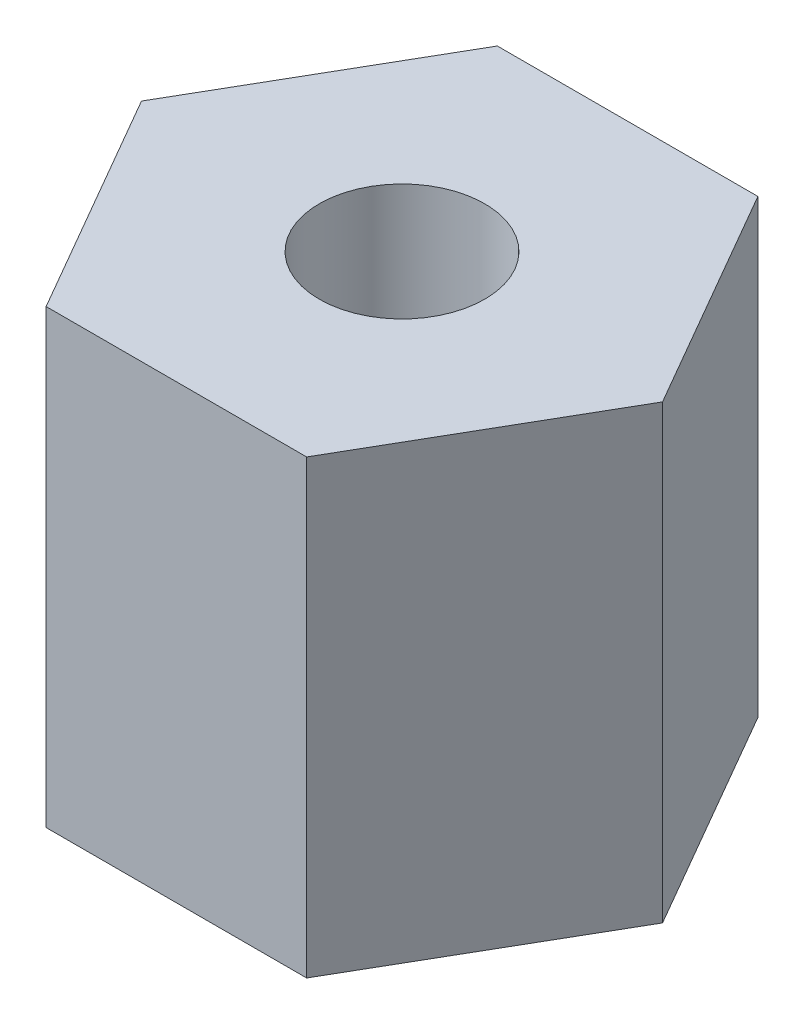
ISO-10303-21;
HEADER;
FILE_DESCRIPTION(('STEP AP214'),'2;1');
FILE_NAME('part.step','',(''),(''),'','','');
FILE_SCHEMA(('AUTOMOTIVE_DESIGN { 1 0 10303 214 1 1 1 1 }'));
ENDSEC;
DATA;
#1=APPLICATION_CONTEXT('core data for automotive mechanical design processes');
#2=APPLICATION_PROTOCOL_DEFINITION('international standard','automotive_design',2000,#1);
#3=PRODUCT_CONTEXT('',#1,'mechanical');
#4=PRODUCT('Part','Part','',(#3));
#5=PRODUCT_RELATED_PRODUCT_CATEGORY('part','',(#4));
#6=PRODUCT_DEFINITION_FORMATION('','',#4);
#7=PRODUCT_DEFINITION_CONTEXT('part definition',#1,'design');
#8=PRODUCT_DEFINITION('design','',#6,#7);
#9=PRODUCT_DEFINITION_SHAPE('','',#8);
#10=(LENGTH_UNIT() NAMED_UNIT(*) SI_UNIT(.MILLI.,.METRE.));
#11=(NAMED_UNIT(*) PLANE_ANGLE_UNIT() SI_UNIT($,.RADIAN.));
#12=(NAMED_UNIT(*) SI_UNIT($,.STERADIAN.) SOLID_ANGLE_UNIT());
#13=UNCERTAINTY_MEASURE_WITH_UNIT(LENGTH_MEASURE(1.E-05),#10,'distance_accuracy_value','');
#14=(GEOMETRIC_REPRESENTATION_CONTEXT(3) GLOBAL_UNCERTAINTY_ASSIGNED_CONTEXT((#13)) GLOBAL_UNIT_ASSIGNED_CONTEXT((#10,
#11,#12)) REPRESENTATION_CONTEXT('',''));
#15=CARTESIAN_POINT('',(0.,0.,0.));
#16=DIRECTION('',(0.,0.,1.));
#17=DIRECTION('',(1.,0.,0.));
#18=AXIS2_PLACEMENT_3D('',#15,#16,#17);
#19=CARTESIAN_POINT('',(0.,6.,0.));
#20=DIRECTION('',(0.,1.,0.));
#21=DIRECTION('',(0.,0.,1.));
#22=AXIS2_PLACEMENT_3D('',#19,#20,#21);
#23=PLANE('',#22);
#24=DIRECTION('',(0.5,0.,-0.866025403784439));
#25=VECTOR('',#24,1.);
#26=CARTESIAN_POINT('',(1.73205080756888,6.,3.));
#27=LINE('',#26,#25);
#28=CARTESIAN_POINT('',(1.73205080756888,6.,3.));
#29=VERTEX_POINT('',#28);
#30=CARTESIAN_POINT('',(3.46410161513775,6.,0.));
#31=VERTEX_POINT('',#30);
#32=EDGE_CURVE('E146',#29,#31,#27,.T.);
#33=ORIENTED_EDGE('',*,*,#32,.T.);
#34=DIRECTION('',(-0.5,0.,-0.866025403784438));
#35=VECTOR('',#34,1.);
#36=CARTESIAN_POINT('',(3.46410161513775,6.,0.));
#37=LINE('',#36,#35);
#38=CARTESIAN_POINT('',(1.73205080756888,6.,-3.));
#39=VERTEX_POINT('',#38);
#40=EDGE_CURVE('E94',#31,#39,#37,.T.);
#41=ORIENTED_EDGE('',*,*,#40,.T.);
#42=DIRECTION('',(-1.,0.,0.));
#43=VECTOR('',#42,1.);
#44=CARTESIAN_POINT('',(1.73205080756888,6.,-3.));
#45=LINE('',#44,#43);
#46=CARTESIAN_POINT('',(-1.73205080756888,6.,-3.));
#47=VERTEX_POINT('',#46);
#48=EDGE_CURVE('E107',#39,#47,#45,.T.);
#49=ORIENTED_EDGE('',*,*,#48,.T.);
#50=DIRECTION('',(-0.5,0.,0.866025403784439));
#51=VECTOR('',#50,1.);
#52=CARTESIAN_POINT('',(-1.73205080756888,6.,-3.));
#53=LINE('',#52,#51);
#54=CARTESIAN_POINT('',(-3.46410161513775,6.,0.));
#55=VERTEX_POINT('',#54);
#56=EDGE_CURVE('E101',#47,#55,#53,.T.);
#57=ORIENTED_EDGE('',*,*,#56,.T.);
#58=DIRECTION('',(0.5,0.,0.866025403784439));
#59=VECTOR('',#58,1.);
#60=CARTESIAN_POINT('',(-3.46410161513775,6.,0.));
#61=LINE('',#60,#59);
#62=CARTESIAN_POINT('',(-1.73205080756888,6.,3.));
#63=VERTEX_POINT('',#62);
#64=EDGE_CURVE('E105',#55,#63,#61,.T.);
#65=ORIENTED_EDGE('',*,*,#64,.T.);
#66=DIRECTION('',(1.,0.,0.));
#67=VECTOR('',#66,1.);
#68=CARTESIAN_POINT('',(-1.73205080756888,6.,3.));
#69=LINE('',#68,#67);
#70=EDGE_CURVE('E57',#63,#29,#69,.T.);
#71=ORIENTED_EDGE('',*,*,#70,.T.);
#72=EDGE_LOOP('',(#33,#41,#49,#57,#65,#71));
#73=FACE_BOUND('',#72,.T.);
#74=CARTESIAN_POINT('',(0.,6.,0.));
#75=DIRECTION('',(0.,1.,0.));
#76=DIRECTION('',(0.,0.,1.));
#77=AXIS2_PLACEMENT_3D('',#74,#75,#76);
#78=CIRCLE('',#77,1.1);
#79=CARTESIAN_POINT('',(0.,6.,1.1));
#80=VERTEX_POINT('',#79);
#81=EDGE_CURVE('E134',#80,#80,#78,.T.);
#82=ORIENTED_EDGE('',*,*,#81,.F.);
#83=EDGE_LOOP('',(#82));
#84=FACE_BOUND('',#83,.T.);
#85=ADVANCED_FACE('F39',(#73,#84),#23,.T.);
#86=CARTESIAN_POINT('',(0.,0.,0.));
#87=DIRECTION('',(0.,1.,0.));
#88=DIRECTION('',(0.,0.,1.));
#89=AXIS2_PLACEMENT_3D('',#86,#87,#88);
#90=PLANE('',#89);
#91=DIRECTION('',(0.5,0.,-0.866025403784439));
#92=VECTOR('',#91,1.);
#93=CARTESIAN_POINT('',(1.73205080756888,0.,3.));
#94=LINE('',#93,#92);
#95=CARTESIAN_POINT('',(1.73205080756888,0.,3.));
#96=VERTEX_POINT('',#95);
#97=CARTESIAN_POINT('',(3.46410161513775,0.,0.));
#98=VERTEX_POINT('',#97);
#99=EDGE_CURVE('E129',#96,#98,#94,.T.);
#100=ORIENTED_EDGE('',*,*,#99,.F.);
#101=DIRECTION('',(1.,0.,0.));
#102=VECTOR('',#101,1.);
#103=CARTESIAN_POINT('',(-1.73205080756888,0.,3.));
#104=LINE('',#103,#102);
#105=CARTESIAN_POINT('',(-1.73205080756888,0.,3.));
#106=VERTEX_POINT('',#105);
#107=EDGE_CURVE('E86',#106,#96,#104,.T.);
#108=ORIENTED_EDGE('',*,*,#107,.F.);
#109=DIRECTION('',(0.5,0.,0.866025403784439));
#110=VECTOR('',#109,1.);
#111=CARTESIAN_POINT('',(-3.46410161513775,0.,0.));
#112=LINE('',#111,#110);
#113=CARTESIAN_POINT('',(-3.46410161513775,0.,0.));
#114=VERTEX_POINT('',#113);
#115=EDGE_CURVE('E80',#114,#106,#112,.T.);
#116=ORIENTED_EDGE('',*,*,#115,.F.);
#117=DIRECTION('',(-0.5,0.,0.866025403784439));
#118=VECTOR('',#117,1.);
#119=CARTESIAN_POINT('',(-1.73205080756888,0.,-3.));
#120=LINE('',#119,#118);
#121=CARTESIAN_POINT('',(-1.73205080756888,0.,-3.));
#122=VERTEX_POINT('',#121);
#123=EDGE_CURVE('E116',#122,#114,#120,.T.);
#124=ORIENTED_EDGE('',*,*,#123,.F.);
#125=DIRECTION('',(-1.,0.,0.));
#126=VECTOR('',#125,1.);
#127=CARTESIAN_POINT('',(1.73205080756888,0.,-3.));
#128=LINE('',#127,#126);
#129=CARTESIAN_POINT('',(1.73205080756888,0.,-3.));
#130=VERTEX_POINT('',#129);
#131=EDGE_CURVE('E137',#130,#122,#128,.T.);
#132=ORIENTED_EDGE('',*,*,#131,.F.);
#133=DIRECTION('',(-0.5,0.,-0.866025403784438));
#134=VECTOR('',#133,1.);
#135=CARTESIAN_POINT('',(3.46410161513775,0.,0.));
#136=LINE('',#135,#134);
#137=EDGE_CURVE('E133',#98,#130,#136,.T.);
#138=ORIENTED_EDGE('',*,*,#137,.F.);
#139=EDGE_LOOP('',(#100,#108,#116,#124,#132,#138));
#140=FACE_BOUND('',#139,.T.);
#141=CARTESIAN_POINT('',(0.,0.,0.));
#142=DIRECTION('',(0.,1.,0.));
#143=DIRECTION('',(0.,0.,1.));
#144=AXIS2_PLACEMENT_3D('',#141,#142,#143);
#145=CIRCLE('',#144,1.1);
#146=CARTESIAN_POINT('',(0.,0.,1.1));
#147=VERTEX_POINT('',#146);
#148=EDGE_CURVE('E243',#147,#147,#145,.T.);
#149=ORIENTED_EDGE('',*,*,#148,.T.);
#150=EDGE_LOOP('',(#149));
#151=FACE_BOUND('',#150,.T.);
#152=ADVANCED_FACE('F159',(#140,#151),#90,.F.);
#153=CARTESIAN_POINT('',(1.73205080756888,6.,3.));
#154=DIRECTION('',(-0.866025403784439,0.,-0.5));
#155=DIRECTION('',(-0.5,0.,0.866025403784439));
#156=AXIS2_PLACEMENT_3D('',#153,#154,#155);
#157=PLANE('',#156);
#158=ORIENTED_EDGE('',*,*,#99,.T.);
#159=DIRECTION('',(0.,-1.,0.));
#160=VECTOR('',#159,1.);
#161=CARTESIAN_POINT('',(3.46410161513775,6.,0.));
#162=LINE('',#161,#160);
#163=EDGE_CURVE('E11',#31,#98,#162,.T.);
#164=ORIENTED_EDGE('',*,*,#163,.F.);
#165=ORIENTED_EDGE('',*,*,#32,.F.);
#166=DIRECTION('',(0.,-1.,0.));
#167=VECTOR('',#166,1.);
#168=CARTESIAN_POINT('',(1.73205080756888,6.,3.));
#169=LINE('',#168,#167);
#170=EDGE_CURVE('E125',#29,#96,#169,.T.);
#171=ORIENTED_EDGE('',*,*,#170,.T.);
#172=EDGE_LOOP('',(#158,#164,#165,#171));
#173=FACE_BOUND('',#172,.T.);
#174=ADVANCED_FACE('F41',(#173),#157,.F.);
#175=CARTESIAN_POINT('',(3.46410161513775,6.,0.));
#176=DIRECTION('',(-0.866025403784438,0.,0.5));
#177=DIRECTION('',(0.5,0.,0.866025403784439));
#178=AXIS2_PLACEMENT_3D('',#175,#176,#177);
#179=PLANE('',#178);
#180=ORIENTED_EDGE('',*,*,#137,.T.);
#181=DIRECTION('',(0.,-1.,0.));
#182=VECTOR('',#181,1.);
#183=CARTESIAN_POINT('',(1.73205080756888,6.,-3.));
#184=LINE('',#183,#182);
#185=EDGE_CURVE('E49',#39,#130,#184,.T.);
#186=ORIENTED_EDGE('',*,*,#185,.F.);
#187=ORIENTED_EDGE('',*,*,#40,.F.);
#188=ORIENTED_EDGE('',*,*,#163,.T.);
#189=EDGE_LOOP('',(#180,#186,#187,#188));
#190=FACE_BOUND('',#189,.T.);
#191=ADVANCED_FACE('F184',(#190),#179,.F.);
#192=CARTESIAN_POINT('',(1.73205080756888,6.,-3.));
#193=DIRECTION('',(0.,0.,1.));
#194=DIRECTION('',(1.,0.,0.));
#195=AXIS2_PLACEMENT_3D('',#192,#193,#194);
#196=PLANE('',#195);
#197=ORIENTED_EDGE('',*,*,#131,.T.);
#198=DIRECTION('',(0.,-1.,0.));
#199=VECTOR('',#198,1.);
#200=CARTESIAN_POINT('',(-1.73205080756888,6.,-3.));
#201=LINE('',#200,#199);
#202=EDGE_CURVE('E118',#47,#122,#201,.T.);
#203=ORIENTED_EDGE('',*,*,#202,.F.);
#204=ORIENTED_EDGE('',*,*,#48,.F.);
#205=ORIENTED_EDGE('',*,*,#185,.T.);
#206=EDGE_LOOP('',(#197,#203,#204,#205));
#207=FACE_BOUND('',#206,.T.);
#208=ADVANCED_FACE('F156',(#207),#196,.F.);
#209=CARTESIAN_POINT('',(-1.73205080756888,6.,-3.));
#210=DIRECTION('',(0.866025403784439,0.,0.5));
#211=DIRECTION('',(0.5,0.,-0.866025403784439));
#212=AXIS2_PLACEMENT_3D('',#209,#210,#211);
#213=PLANE('',#212);
#214=ORIENTED_EDGE('',*,*,#123,.T.);
#215=DIRECTION('',(0.,-1.,0.));
#216=VECTOR('',#215,1.);
#217=CARTESIAN_POINT('',(-3.46410161513775,6.,0.));
#218=LINE('',#217,#216);
#219=EDGE_CURVE('E113',#55,#114,#218,.T.);
#220=ORIENTED_EDGE('',*,*,#219,.F.);
#221=ORIENTED_EDGE('',*,*,#56,.F.);
#222=ORIENTED_EDGE('',*,*,#202,.T.);
#223=EDGE_LOOP('',(#214,#220,#221,#222));
#224=FACE_BOUND('',#223,.T.);
#225=ADVANCED_FACE('F114',(#224),#213,.F.);
#226=CARTESIAN_POINT('',(-3.46410161513775,6.,0.));
#227=DIRECTION('',(0.866025403784439,0.,-0.5));
#228=DIRECTION('',(-0.5,0.,-0.866025403784439));
#229=AXIS2_PLACEMENT_3D('',#226,#227,#228);
#230=PLANE('',#229);
#231=ORIENTED_EDGE('',*,*,#115,.T.);
#232=DIRECTION('',(0.,-1.,0.));
#233=VECTOR('',#232,1.);
#234=CARTESIAN_POINT('',(-1.73205080756888,6.,3.));
#235=LINE('',#234,#233);
#236=EDGE_CURVE('E119',#63,#106,#235,.T.);
#237=ORIENTED_EDGE('',*,*,#236,.F.);
#238=ORIENTED_EDGE('',*,*,#64,.F.);
#239=ORIENTED_EDGE('',*,*,#219,.T.);
#240=EDGE_LOOP('',(#231,#237,#238,#239));
#241=FACE_BOUND('',#240,.T.);
#242=ADVANCED_FACE('F121',(#241),#230,.F.);
#243=CARTESIAN_POINT('',(-1.73205080756888,6.,3.));
#244=DIRECTION('',(0.,0.,-1.));
#245=DIRECTION('',(-1.,0.,0.));
#246=AXIS2_PLACEMENT_3D('',#243,#244,#245);
#247=PLANE('',#246);
#248=ORIENTED_EDGE('',*,*,#107,.T.);
#249=ORIENTED_EDGE('',*,*,#170,.F.);
#250=ORIENTED_EDGE('',*,*,#70,.F.);
#251=ORIENTED_EDGE('',*,*,#236,.T.);
#252=EDGE_LOOP('',(#248,#249,#250,#251));
#253=FACE_BOUND('',#252,.T.);
#254=ADVANCED_FACE('F164',(#253),#247,.F.);
#255=CARTESIAN_POINT('',(0.,6.,0.));
#256=DIRECTION('',(0.,-1.,0.));
#257=DIRECTION('',(0.,0.,-1.));
#258=AXIS2_PLACEMENT_3D('',#255,#256,#257);
#259=CYLINDRICAL_SURFACE('',#258,1.1);
#260=ORIENTED_EDGE('',*,*,#81,.T.);
#261=EDGE_LOOP('',(#260));
#262=FACE_BOUND('',#261,.T.);
#263=ORIENTED_EDGE('',*,*,#148,.F.);
#264=EDGE_LOOP('',(#263));
#265=FACE_BOUND('',#264,.T.);
#266=ADVANCED_FACE('F166',(#262,#265),#259,.F.);
#267=CLOSED_SHELL('',(#85,#152,#174,#191,#208,#225,#242,#254,#266));
#268=MANIFOLD_SOLID_BREP('B2',#267);
#269=ADVANCED_BREP_SHAPE_REPRESENTATION('',(#18,#268),#14);
#270=SHAPE_DEFINITION_REPRESENTATION(#9,#269);
ENDSEC;
END-ISO-10303-21;
